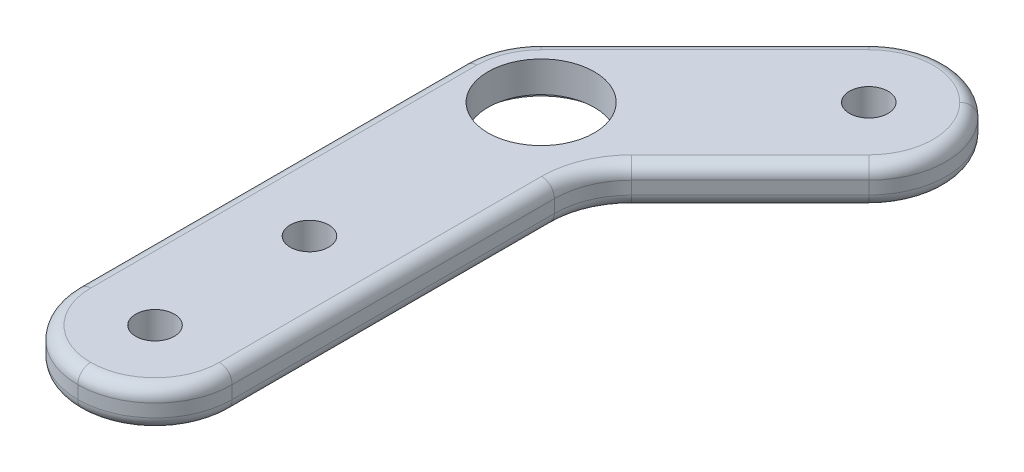
ISO-10303-21;
HEADER;
FILE_DESCRIPTION(('STEP AP214'),'2;1');
FILE_NAME('part.step','',(''),(''),'','','');
FILE_SCHEMA(('AUTOMOTIVE_DESIGN { 1 0 10303 214 1 1 1 1 }'));
ENDSEC;
DATA;
#1=APPLICATION_CONTEXT('core data for automotive mechanical design processes');
#2=APPLICATION_PROTOCOL_DEFINITION('international standard','automotive_design',2000,#1);
#3=PRODUCT_CONTEXT('',#1,'mechanical');
#4=PRODUCT('Part','Part','',(#3));
#5=PRODUCT_RELATED_PRODUCT_CATEGORY('part','',(#4));
#6=PRODUCT_DEFINITION_FORMATION('','',#4);
#7=PRODUCT_DEFINITION_CONTEXT('part definition',#1,'design');
#8=PRODUCT_DEFINITION('design','',#6,#7);
#9=PRODUCT_DEFINITION_SHAPE('','',#8);
#10=(LENGTH_UNIT() NAMED_UNIT(*) SI_UNIT(.MILLI.,.METRE.));
#11=(NAMED_UNIT(*) PLANE_ANGLE_UNIT() SI_UNIT($,.RADIAN.));
#12=(NAMED_UNIT(*) SI_UNIT($,.STERADIAN.) SOLID_ANGLE_UNIT());
#13=UNCERTAINTY_MEASURE_WITH_UNIT(LENGTH_MEASURE(1.E-05),#10,'distance_accuracy_value','');
#14=(GEOMETRIC_REPRESENTATION_CONTEXT(3) GLOBAL_UNCERTAINTY_ASSIGNED_CONTEXT((#13)) GLOBAL_UNIT_ASSIGNED_CONTEXT((#10,
#11,#12)) REPRESENTATION_CONTEXT('',''));
#15=CARTESIAN_POINT('',(0.,0.,0.));
#16=DIRECTION('',(0.,0.,1.));
#17=DIRECTION('',(1.,0.,0.));
#18=AXIS2_PLACEMENT_3D('',#15,#16,#17);
#19=CARTESIAN_POINT('',(0.,6.35,-31.7500000000001));
#20=DIRECTION('',(0.,-1.,0.));
#21=DIRECTION('',(0.,0.,-1.));
#22=AXIS2_PLACEMENT_3D('',#19,#20,#21);
#23=CYLINDRICAL_SURFACE('',#22,8.73125);
#24=CARTESIAN_POINT('',(0.,6.35,-31.7500000000001));
#25=DIRECTION('',(0.,1.,0.));
#26=DIRECTION('',(0.,0.,1.));
#27=AXIS2_PLACEMENT_3D('',#24,#25,#26);
#28=CIRCLE('',#27,8.73125);
#29=CARTESIAN_POINT('',(0.,6.35,-23.0187500000001));
#30=VERTEX_POINT('',#29);
#31=EDGE_CURVE('E788',#30,#30,#28,.T.);
#32=ORIENTED_EDGE('',*,*,#31,.T.);
#33=EDGE_LOOP('',(#32));
#34=FACE_BOUND('',#33,.T.);
#35=CARTESIAN_POINT('',(0.,1.27,-31.7500000000001));
#36=DIRECTION('',(0.,-1.,0.));
#37=DIRECTION('',(0.,0.,-1.));
#38=AXIS2_PLACEMENT_3D('',#35,#36,#37);
#39=CIRCLE('',#38,8.73125);
#40=CARTESIAN_POINT('',(0.,1.27,-40.4812500000001));
#41=VERTEX_POINT('',#40);
#42=EDGE_CURVE('E45',#41,#41,#39,.T.);
#43=ORIENTED_EDGE('',*,*,#42,.T.);
#44=EDGE_LOOP('',(#43));
#45=FACE_BOUND('',#44,.T.);
#46=ADVANCED_FACE('F41',(#34,#45),#23,.F.);
#47=CARTESIAN_POINT('',(-24.8552561210692,6.35,-24.8552561210689));
#48=DIRECTION('',(0.707106781186551,0.,0.707106781186544));
#49=DIRECTION('',(0.707106781186544,0.,-0.707106781186551));
#50=AXIS2_PLACEMENT_3D('',#47,#48,#49);
#51=PLANE('',#50);
#52=DIRECTION('',(0.,-1.,0.));
#53=VECTOR('',#52,1.);
#54=CARTESIAN_POINT('',(17.960512242138,6.35,-67.6710244842766));
#55=LINE('',#54,#53);
#56=CARTESIAN_POINT('',(17.960512242138,4.23333333333333,-67.6710244842766));
#57=VERTEX_POINT('',#56);
#58=CARTESIAN_POINT('',(17.960512242138,2.11666666666667,-67.6710244842766));
#59=VERTEX_POINT('',#58);
#60=EDGE_CURVE('E208',#57,#59,#55,.T.);
#61=ORIENTED_EDGE('',*,*,#60,.T.);
#62=DIRECTION('',(-0.707106781186544,0.,0.707106781186551));
#63=VECTOR('',#62,1.);
#64=CARTESIAN_POINT('',(-24.8552561210692,2.11666666666667,-24.8552561210689));
#65=LINE('',#64,#63);
#66=CARTESIAN_POINT('',(-8.9802561210692,2.11666666666667,-40.7302561210691));
#67=VERTEX_POINT('',#66);
#68=EDGE_CURVE('E257',#59,#67,#65,.T.);
#69=ORIENTED_EDGE('',*,*,#68,.T.);
#70=DIRECTION('',(0.,-1.,0.));
#71=VECTOR('',#70,1.);
#72=CARTESIAN_POINT('',(-8.9802561210692,6.35,-40.7302561210691));
#73=LINE('',#72,#71);
#74=CARTESIAN_POINT('',(-8.9802561210692,4.23333333333333,-40.7302561210691));
#75=VERTEX_POINT('',#74);
#76=EDGE_CURVE('E348',#75,#67,#73,.T.);
#77=ORIENTED_EDGE('',*,*,#76,.F.);
#78=DIRECTION('',(-0.707106781186544,0.,0.707106781186551));
#79=VECTOR('',#78,1.);
#80=CARTESIAN_POINT('',(17.960512242138,4.23333333333333,-67.6710244842767));
#81=LINE('',#80,#79);
#82=EDGE_CURVE('E255',#75,#57,#81,.F.);
#83=ORIENTED_EDGE('',*,*,#82,.T.);
#84=EDGE_LOOP('',(#61,#69,#77,#83));
#85=FACE_BOUND('',#84,.T.);
#86=ADVANCED_FACE('F354',(#85),#51,.F.);
#87=CARTESIAN_POINT('',(0.,6.35,-31.7500000000001));
#88=DIRECTION('',(0.,-1.,0.));
#89=DIRECTION('',(0.,0.,-1.));
#90=AXIS2_PLACEMENT_3D('',#87,#88,#89);
#91=CYLINDRICAL_SURFACE('',#90,12.7);
#92=ORIENTED_EDGE('',*,*,#76,.T.);
#93=CARTESIAN_POINT('',(0.,2.11666666666667,-31.7500000000001));
#94=DIRECTION('',(0.,1.,0.));
#95=DIRECTION('',(0.,0.,1.));
#96=AXIS2_PLACEMENT_3D('',#93,#94,#95);
#97=CIRCLE('',#96,12.7);
#98=CARTESIAN_POINT('',(-12.7,2.11666666666667,-31.7500000000001));
#99=VERTEX_POINT('',#98);
#100=EDGE_CURVE('E253',#67,#99,#97,.T.);
#101=ORIENTED_EDGE('',*,*,#100,.T.);
#102=DIRECTION('',(0.,-1.,0.));
#103=VECTOR('',#102,1.);
#104=CARTESIAN_POINT('',(-12.7,6.35,-31.7500000000001));
#105=LINE('',#104,#103);
#106=CARTESIAN_POINT('',(-12.7,4.23333333333333,-31.7500000000001));
#107=VERTEX_POINT('',#106);
#108=EDGE_CURVE('E351',#107,#99,#105,.T.);
#109=ORIENTED_EDGE('',*,*,#108,.F.);
#110=CARTESIAN_POINT('',(0.,4.23333333333333,-31.7500000000001));
#111=DIRECTION('',(0.,1.,0.));
#112=DIRECTION('',(0.,0.,1.));
#113=AXIS2_PLACEMENT_3D('',#110,#111,#112);
#114=CIRCLE('',#113,12.7);
#115=EDGE_CURVE('E251',#107,#75,#114,.F.);
#116=ORIENTED_EDGE('',*,*,#115,.T.);
#117=EDGE_LOOP('',(#92,#101,#109,#116));
#118=FACE_BOUND('',#117,.T.);
#119=ADVANCED_FACE('F347',(#118),#91,.T.);
#120=CARTESIAN_POINT('',(-12.7,6.35,0.));
#121=DIRECTION('',(-1.,0.,0.));
#122=DIRECTION('',(0.,0.,1.));
#123=AXIS2_PLACEMENT_3D('',#120,#121,#122);
#124=PLANE('',#123);
#125=ORIENTED_EDGE('',*,*,#108,.T.);
#126=DIRECTION('',(0.,0.,-1.));
#127=VECTOR('',#126,1.);
#128=CARTESIAN_POINT('',(-12.7,2.11666666666667,31.7499999999999));
#129=LINE('',#128,#127);
#130=CARTESIAN_POINT('',(-12.7,2.11666666666667,31.7499999999999));
#131=VERTEX_POINT('',#130);
#132=EDGE_CURVE('E249',#99,#131,#129,.F.);
#133=ORIENTED_EDGE('',*,*,#132,.T.);
#134=DIRECTION('',(0.,-1.,0.));
#135=VECTOR('',#134,1.);
#136=CARTESIAN_POINT('',(-12.7,6.35,31.7499999999999));
#137=LINE('',#136,#135);
#138=CARTESIAN_POINT('',(-12.7,4.23333333333333,31.7499999999999));
#139=VERTEX_POINT('',#138);
#140=EDGE_CURVE('E205',#131,#139,#137,.F.);
#141=ORIENTED_EDGE('',*,*,#140,.T.);
#142=DIRECTION('',(0.,0.,-1.));
#143=VECTOR('',#142,1.);
#144=CARTESIAN_POINT('',(-12.7,4.23333333333333,0.));
#145=LINE('',#144,#143);
#146=EDGE_CURVE('E247',#139,#107,#145,.T.);
#147=ORIENTED_EDGE('',*,*,#146,.T.);
#148=EDGE_LOOP('',(#125,#133,#141,#147));
#149=FACE_BOUND('',#148,.T.);
#150=ADVANCED_FACE('F505',(#149),#124,.T.);
#151=CARTESIAN_POINT('',(12.7,6.35,0.));
#152=DIRECTION('',(-1.,0.,0.));
#153=DIRECTION('',(0.,0.,1.));
#154=AXIS2_PLACEMENT_3D('',#151,#152,#153);
#155=PLANE('',#154);
#156=DIRECTION('',(0.,-1.,0.));
#157=VECTOR('',#156,1.);
#158=CARTESIAN_POINT('',(12.7,6.35,31.7499999999999));
#159=LINE('',#158,#157);
#160=CARTESIAN_POINT('',(12.7,4.23333333333333,31.7499999999999));
#161=VERTEX_POINT('',#160);
#162=CARTESIAN_POINT('',(12.7,2.11666666666667,31.7499999999999));
#163=VERTEX_POINT('',#162);
#164=EDGE_CURVE('E368',#161,#163,#159,.T.);
#165=ORIENTED_EDGE('',*,*,#164,.T.);
#166=DIRECTION('',(0.,0.,-1.));
#167=VECTOR('',#166,1.);
#168=CARTESIAN_POINT('',(12.7,2.11666666666667,0.));
#169=LINE('',#168,#167);
#170=CARTESIAN_POINT('',(12.7,2.11666666666667,-21.2289755157235));
#171=VERTEX_POINT('',#170);
#172=EDGE_CURVE('E237',#163,#171,#169,.T.);
#173=ORIENTED_EDGE('',*,*,#172,.T.);
#174=DIRECTION('',(0.,-1.,0.));
#175=VECTOR('',#174,1.);
#176=CARTESIAN_POINT('',(12.7,6.35,-21.2289755157235));
#177=LINE('',#176,#175);
#178=CARTESIAN_POINT('',(12.7,4.23333333333333,-21.2289755157235));
#179=VERTEX_POINT('',#178);
#180=EDGE_CURVE('E371',#171,#179,#177,.F.);
#181=ORIENTED_EDGE('',*,*,#180,.T.);
#182=DIRECTION('',(0.,0.,-1.));
#183=VECTOR('',#182,1.);
#184=CARTESIAN_POINT('',(12.7,4.23333333333333,31.7499999999999));
#185=LINE('',#184,#183);
#186=EDGE_CURVE('E235',#179,#161,#185,.F.);
#187=ORIENTED_EDGE('',*,*,#186,.T.);
#188=EDGE_LOOP('',(#165,#173,#181,#187));
#189=FACE_BOUND('',#188,.T.);
#190=ADVANCED_FACE('F502',(#189),#155,.F.);
#191=CARTESIAN_POINT('',(-6.89474387893084,6.35,-6.89474387893076));
#192=DIRECTION('',(-0.707106781186551,0.,-0.707106781186544));
#193=DIRECTION('',(-0.707106781186544,0.,0.707106781186551));
#194=AXIS2_PLACEMENT_3D('',#191,#192,#193);
#195=PLANE('',#194);
#196=DIRECTION('',(0.,-1.,0.));
#197=VECTOR('',#196,1.);
#198=CARTESIAN_POINT('',(16.4197438789308,0.,-30.2092316367927));
#199=LINE('',#198,#197);
#200=CARTESIAN_POINT('',(16.4197438789308,4.23333333333333,-30.2092316367927));
#201=VERTEX_POINT('',#200);
#202=CARTESIAN_POINT('',(16.4197438789308,2.11666666666667,-30.2092316367927));
#203=VERTEX_POINT('',#202);
#204=EDGE_CURVE('E360',#201,#203,#199,.T.);
#205=ORIENTED_EDGE('',*,*,#204,.T.);
#206=DIRECTION('',(0.707106781186544,0.,-0.707106781186551));
#207=VECTOR('',#206,1.);
#208=CARTESIAN_POINT('',(-6.89474387893084,2.11666666666667,-6.89474387893076));
#209=LINE('',#208,#207);
#210=CARTESIAN_POINT('',(35.9210244842764,2.11666666666667,-49.7105122421385));
#211=VERTEX_POINT('',#210);
#212=EDGE_CURVE('E11',#203,#211,#209,.T.);
#213=ORIENTED_EDGE('',*,*,#212,.T.);
#214=DIRECTION('',(0.,-1.,0.));
#215=VECTOR('',#214,1.);
#216=CARTESIAN_POINT('',(35.9210244842764,6.35,-49.7105122421385));
#217=LINE('',#216,#215);
#218=CARTESIAN_POINT('',(35.9210244842764,4.23333333333333,-49.7105122421385));
#219=VERTEX_POINT('',#218);
#220=EDGE_CURVE('E357',#211,#219,#217,.F.);
#221=ORIENTED_EDGE('',*,*,#220,.T.);
#222=DIRECTION('',(0.707106781186544,0.,-0.707106781186551));
#223=VECTOR('',#222,1.);
#224=CARTESIAN_POINT('',(16.4197438789308,4.23333333333333,-30.2092316367927));
#225=LINE('',#224,#223);
#226=EDGE_CURVE('E50',#219,#201,#225,.F.);
#227=ORIENTED_EDGE('',*,*,#226,.T.);
#228=EDGE_LOOP('',(#205,#213,#221,#227));
#229=FACE_BOUND('',#228,.T.);
#230=ADVANCED_FACE('F422',(#229),#195,.F.);
#231=CARTESIAN_POINT('',(0.,6.35,31.7499999999999));
#232=DIRECTION('',(0.,-1.,0.));
#233=DIRECTION('',(0.,0.,-1.));
#234=AXIS2_PLACEMENT_3D('',#231,#232,#233);
#235=CYLINDRICAL_SURFACE('',#234,3.175);
#236=CARTESIAN_POINT('',(0.,6.35,31.7499999999999));
#237=DIRECTION('',(0.,1.,0.));
#238=DIRECTION('',(0.,0.,1.));
#239=AXIS2_PLACEMENT_3D('',#236,#237,#238);
#240=CIRCLE('',#239,3.175);
#241=CARTESIAN_POINT('',(0.,6.35,34.9249999999999));
#242=VERTEX_POINT('',#241);
#243=EDGE_CURVE('E784',#242,#242,#240,.T.);
#244=ORIENTED_EDGE('',*,*,#243,.T.);
#245=EDGE_LOOP('',(#244));
#246=FACE_BOUND('',#245,.T.);
#247=CARTESIAN_POINT('',(0.,0.,31.7499999999999));
#248=DIRECTION('',(0.,1.,0.));
#249=DIRECTION('',(0.,0.,1.));
#250=AXIS2_PLACEMENT_3D('',#247,#248,#249);
#251=CIRCLE('',#250,3.175);
#252=CARTESIAN_POINT('',(0.,0.,34.9249999999999));
#253=VERTEX_POINT('',#252);
#254=EDGE_CURVE('E381',#253,#253,#251,.T.);
#255=ORIENTED_EDGE('',*,*,#254,.F.);
#256=EDGE_LOOP('',(#255));
#257=FACE_BOUND('',#256,.T.);
#258=ADVANCED_FACE('F492',(#246,#257),#235,.F.);
#259=CARTESIAN_POINT('',(0.,6.35,6.34999999999994));
#260=DIRECTION('',(0.,-1.,0.));
#261=DIRECTION('',(0.,0.,-1.));
#262=AXIS2_PLACEMENT_3D('',#259,#260,#261);
#263=CYLINDRICAL_SURFACE('',#262,3.175);
#264=CARTESIAN_POINT('',(0.,6.35,6.34999999999994));
#265=DIRECTION('',(0.,1.,0.));
#266=DIRECTION('',(0.,0.,1.));
#267=AXIS2_PLACEMENT_3D('',#264,#265,#266);
#268=CIRCLE('',#267,3.175);
#269=CARTESIAN_POINT('',(0.,6.35,9.52499999999994));
#270=VERTEX_POINT('',#269);
#271=EDGE_CURVE('E781',#270,#270,#268,.T.);
#272=ORIENTED_EDGE('',*,*,#271,.T.);
#273=EDGE_LOOP('',(#272));
#274=FACE_BOUND('',#273,.T.);
#275=CARTESIAN_POINT('',(0.,0.,6.34999999999994));
#276=DIRECTION('',(0.,1.,0.));
#277=DIRECTION('',(0.,0.,1.));
#278=AXIS2_PLACEMENT_3D('',#275,#276,#277);
#279=CIRCLE('',#278,3.175);
#280=CARTESIAN_POINT('',(0.,0.,9.52499999999994));
#281=VERTEX_POINT('',#280);
#282=EDGE_CURVE('E376',#281,#281,#279,.T.);
#283=ORIENTED_EDGE('',*,*,#282,.F.);
#284=EDGE_LOOP('',(#283));
#285=FACE_BOUND('',#284,.T.);
#286=ADVANCED_FACE('F495',(#274,#285),#263,.F.);
#287=CARTESIAN_POINT('',(26.9407683632073,6.35,-58.6907683632077));
#288=DIRECTION('',(0.,-1.,0.));
#289=DIRECTION('',(0.,0.,-1.));
#290=AXIS2_PLACEMENT_3D('',#287,#288,#289);
#291=CYLINDRICAL_SURFACE('',#290,3.175);
#292=CARTESIAN_POINT('',(26.9407683632073,6.35,-58.6907683632077));
#293=DIRECTION('',(0.,1.,0.));
#294=DIRECTION('',(0.,0.,1.));
#295=AXIS2_PLACEMENT_3D('',#292,#293,#294);
#296=CIRCLE('',#295,3.175);
#297=CARTESIAN_POINT('',(26.9407683632073,6.35,-55.5157683632077));
#298=VERTEX_POINT('',#297);
#299=EDGE_CURVE('E362',#298,#298,#296,.T.);
#300=ORIENTED_EDGE('',*,*,#299,.T.);
#301=EDGE_LOOP('',(#300));
#302=FACE_BOUND('',#301,.T.);
#303=CARTESIAN_POINT('',(26.9407683632073,0.,-58.6907683632077));
#304=DIRECTION('',(0.,1.,0.));
#305=DIRECTION('',(0.,0.,1.));
#306=AXIS2_PLACEMENT_3D('',#303,#304,#305);
#307=CIRCLE('',#306,3.175);
#308=CARTESIAN_POINT('',(26.9407683632073,0.,-55.5157683632077));
#309=VERTEX_POINT('',#308);
#310=EDGE_CURVE('E785',#309,#309,#307,.T.);
#311=ORIENTED_EDGE('',*,*,#310,.F.);
#312=EDGE_LOOP('',(#311));
#313=FACE_BOUND('',#312,.T.);
#314=ADVANCED_FACE('F490',(#302,#313),#291,.F.);
#315=CARTESIAN_POINT('',(0.,6.35,0.));
#316=DIRECTION('',(0.,1.,0.));
#317=DIRECTION('',(0.,0.,1.));
#318=AXIS2_PLACEMENT_3D('',#315,#316,#317);
#319=PLANE('',#318);
#320=DIRECTION('',(0.,0.,-1.));
#321=VECTOR('',#320,1.);
#322=CARTESIAN_POINT('',(10.5833333333333,6.35,-21.2289755157235));
#323=LINE('',#322,#321);
#324=CARTESIAN_POINT('',(10.5833333333333,6.35,31.7499999999999));
#325=VERTEX_POINT('',#324);
#326=CARTESIAN_POINT('',(10.5833333333333,6.35,-21.2289755157235));
#327=VERTEX_POINT('',#326);
#328=EDGE_CURVE('E58',#325,#327,#323,.T.);
#329=ORIENTED_EDGE('',*,*,#328,.T.);
#330=CARTESIAN_POINT('',(25.4,6.35,-21.2289755157236));
#331=DIRECTION('',(0.,1.,0.));
#332=DIRECTION('',(0.,0.,1.));
#333=AXIS2_PLACEMENT_3D('',#330,#331,#332);
#334=CIRCLE('',#333,14.8166666666667);
#335=CARTESIAN_POINT('',(14.9230345254193,6.35,-31.7059409903042));
#336=VERTEX_POINT('',#335);
#337=EDGE_CURVE('E282',#327,#336,#334,.F.);
#338=ORIENTED_EDGE('',*,*,#337,.T.);
#339=DIRECTION('',(0.707106781186544,0.,-0.707106781186551));
#340=VECTOR('',#339,1.);
#341=CARTESIAN_POINT('',(34.4243151307649,6.35,-51.20722159565));
#342=LINE('',#341,#340);
#343=CARTESIAN_POINT('',(34.4243151307649,6.35,-51.20722159565));
#344=VERTEX_POINT('',#343);
#345=EDGE_CURVE('E266',#336,#344,#342,.T.);
#346=ORIENTED_EDGE('',*,*,#345,.T.);
#347=CARTESIAN_POINT('',(26.9407683632072,6.35,-58.6907683632076));
#348=DIRECTION('',(0.,1.,0.));
#349=DIRECTION('',(0.,0.,1.));
#350=AXIS2_PLACEMENT_3D('',#347,#348,#349);
#351=CIRCLE('',#350,10.5833333333333);
#352=CARTESIAN_POINT('',(34.4243151307648,6.35,-66.1743151307652));
#353=VERTEX_POINT('',#352);
#354=EDGE_CURVE('E268',#344,#353,#351,.T.);
#355=ORIENTED_EDGE('',*,*,#354,.T.);
#356=CARTESIAN_POINT('',(26.9407683632072,6.35,-58.6907683632075));
#357=DIRECTION('',(0.,1.,0.));
#358=DIRECTION('',(0.,0.,1.));
#359=AXIS2_PLACEMENT_3D('',#356,#357,#358);
#360=CIRCLE('',#359,10.5833333333333);
#361=CARTESIAN_POINT('',(19.4572215956495,6.35,-66.1743151307651));
#362=VERTEX_POINT('',#361);
#363=EDGE_CURVE('E270',#353,#362,#360,.T.);
#364=ORIENTED_EDGE('',*,*,#363,.T.);
#365=DIRECTION('',(-0.707106781186544,0.,0.707106781186551));
#366=VECTOR('',#365,1.);
#367=CARTESIAN_POINT('',(-7.48354676755766,6.35,-39.2335467675576));
#368=LINE('',#367,#366);
#369=CARTESIAN_POINT('',(-7.48354676755767,6.35,-39.2335467675576));
#370=VERTEX_POINT('',#369);
#371=EDGE_CURVE('E272',#362,#370,#368,.T.);
#372=ORIENTED_EDGE('',*,*,#371,.T.);
#373=CARTESIAN_POINT('',(0.,6.35,-31.7500000000001));
#374=DIRECTION('',(0.,1.,0.));
#375=DIRECTION('',(0.,0.,1.));
#376=AXIS2_PLACEMENT_3D('',#373,#374,#375);
#377=CIRCLE('',#376,10.5833333333333);
#378=CARTESIAN_POINT('',(-10.5833333333333,6.35,-31.7500000000001));
#379=VERTEX_POINT('',#378);
#380=EDGE_CURVE('E274',#370,#379,#377,.T.);
#381=ORIENTED_EDGE('',*,*,#380,.T.);
#382=DIRECTION('',(0.,0.,-1.));
#383=VECTOR('',#382,1.);
#384=CARTESIAN_POINT('',(-10.5833333333333,6.35,0.));
#385=LINE('',#384,#383);
#386=CARTESIAN_POINT('',(-10.5833333333333,6.35,31.7499999999999));
#387=VERTEX_POINT('',#386);
#388=EDGE_CURVE('E276',#379,#387,#385,.F.);
#389=ORIENTED_EDGE('',*,*,#388,.T.);
#390=CARTESIAN_POINT('',(0.,6.35,31.7499999999999));
#391=DIRECTION('',(0.,1.,0.));
#392=DIRECTION('',(0.,0.,1.));
#393=AXIS2_PLACEMENT_3D('',#390,#391,#392);
#394=CIRCLE('',#393,10.5833333333333);
#395=CARTESIAN_POINT('',(0.,6.35,42.3333333333333));
#396=VERTEX_POINT('',#395);
#397=EDGE_CURVE('E278',#387,#396,#394,.T.);
#398=ORIENTED_EDGE('',*,*,#397,.T.);
#399=CARTESIAN_POINT('',(0.,6.35,31.7499999999999));
#400=DIRECTION('',(0.,1.,0.));
#401=DIRECTION('',(0.,0.,1.));
#402=AXIS2_PLACEMENT_3D('',#399,#400,#401);
#403=CIRCLE('',#402,10.5833333333333);
#404=EDGE_CURVE('E63',#396,#325,#403,.T.);
#405=ORIENTED_EDGE('',*,*,#404,.T.);
#406=EDGE_LOOP('',(#329,#338,#346,#355,#364,#372,#381,#389,#398,#405));
#407=FACE_BOUND('',#406,.T.);
#408=ORIENTED_EDGE('',*,*,#271,.F.);
#409=EDGE_LOOP('',(#408));
#410=FACE_BOUND('',#409,.T.);
#411=ORIENTED_EDGE('',*,*,#243,.F.);
#412=EDGE_LOOP('',(#411));
#413=FACE_BOUND('',#412,.T.);
#414=ORIENTED_EDGE('',*,*,#31,.F.);
#415=EDGE_LOOP('',(#414));
#416=FACE_BOUND('',#415,.T.);
#417=ORIENTED_EDGE('',*,*,#299,.F.);
#418=EDGE_LOOP('',(#417));
#419=FACE_BOUND('',#418,.T.);
#420=ADVANCED_FACE('F408',(#407,#410,#413,#416,#419),#319,.T.);
#421=CARTESIAN_POINT('',(0.,0.,0.));
#422=DIRECTION('',(0.,1.,0.));
#423=DIRECTION('',(0.,0.,1.));
#424=AXIS2_PLACEMENT_3D('',#421,#422,#423);
#425=PLANE('',#424);
#426=CARTESIAN_POINT('',(0.,0.,-31.7500000000001));
#427=DIRECTION('',(0.,-1.,0.));
#428=DIRECTION('',(0.,0.,-1.));
#429=AXIS2_PLACEMENT_3D('',#426,#427,#428);
#430=CIRCLE('',#429,10.2489);
#431=CARTESIAN_POINT('',(0.,0.,-41.9989000000001));
#432=VERTEX_POINT('',#431);
#433=EDGE_CURVE('E776',#432,#432,#430,.T.);
#434=ORIENTED_EDGE('',*,*,#433,.F.);
#435=EDGE_LOOP('',(#434));
#436=FACE_BOUND('',#435,.T.);
#437=DIRECTION('',(0.707106781186544,0.,-0.707106781186551));
#438=VECTOR('',#437,1.);
#439=CARTESIAN_POINT('',(-8.39145323244237,0.,-8.39145323244228));
#440=LINE('',#439,#438);
#441=CARTESIAN_POINT('',(34.4243151307649,0.,-51.20722159565));
#442=VERTEX_POINT('',#441);
#443=CARTESIAN_POINT('',(14.9230345254193,0.,-31.7059409903042));
#444=VERTEX_POINT('',#443);
#445=EDGE_CURVE('E184',#442,#444,#440,.F.);
#446=ORIENTED_EDGE('',*,*,#445,.T.);
#447=CARTESIAN_POINT('',(25.4,0.,-21.2289755157236));
#448=DIRECTION('',(0.,1.,0.));
#449=DIRECTION('',(0.,0.,1.));
#450=AXIS2_PLACEMENT_3D('',#447,#448,#449);
#451=CIRCLE('',#450,14.8166666666667);
#452=CARTESIAN_POINT('',(10.5833333333333,0.,-21.2289755157235));
#453=VERTEX_POINT('',#452);
#454=EDGE_CURVE('E227',#444,#453,#451,.T.);
#455=ORIENTED_EDGE('',*,*,#454,.T.);
#456=DIRECTION('',(0.,0.,-1.));
#457=VECTOR('',#456,1.);
#458=CARTESIAN_POINT('',(10.5833333333333,0.,0.));
#459=LINE('',#458,#457);
#460=CARTESIAN_POINT('',(10.5833333333333,0.,31.7499999999999));
#461=VERTEX_POINT('',#460);
#462=EDGE_CURVE('E225',#453,#461,#459,.F.);
#463=ORIENTED_EDGE('',*,*,#462,.T.);
#464=CARTESIAN_POINT('',(0.,0.,31.7499999999999));
#465=DIRECTION('',(0.,1.,0.));
#466=DIRECTION('',(0.,0.,1.));
#467=AXIS2_PLACEMENT_3D('',#464,#465,#466);
#468=CIRCLE('',#467,10.5833333333333);
#469=CARTESIAN_POINT('',(0.,0.,42.3333333333333));
#470=VERTEX_POINT('',#469);
#471=EDGE_CURVE('E223',#461,#470,#468,.F.);
#472=ORIENTED_EDGE('',*,*,#471,.T.);
#473=CARTESIAN_POINT('',(0.,0.,31.7499999999999));
#474=DIRECTION('',(0.,1.,0.));
#475=DIRECTION('',(0.,0.,1.));
#476=AXIS2_PLACEMENT_3D('',#473,#474,#475);
#477=CIRCLE('',#476,10.5833333333333);
#478=CARTESIAN_POINT('',(-10.5833333333333,0.,31.7499999999999));
#479=VERTEX_POINT('',#478);
#480=EDGE_CURVE('E221',#470,#479,#477,.F.);
#481=ORIENTED_EDGE('',*,*,#480,.T.);
#482=DIRECTION('',(0.,0.,-1.));
#483=VECTOR('',#482,1.);
#484=CARTESIAN_POINT('',(-10.5833333333333,0.,-31.7500000000001));
#485=LINE('',#484,#483);
#486=CARTESIAN_POINT('',(-10.5833333333333,0.,-31.7500000000001));
#487=VERTEX_POINT('',#486);
#488=EDGE_CURVE('E219',#479,#487,#485,.T.);
#489=ORIENTED_EDGE('',*,*,#488,.T.);
#490=CARTESIAN_POINT('',(0.,0.,-31.7500000000001));
#491=DIRECTION('',(0.,1.,0.));
#492=DIRECTION('',(0.,0.,1.));
#493=AXIS2_PLACEMENT_3D('',#490,#491,#492);
#494=CIRCLE('',#493,10.5833333333333);
#495=CARTESIAN_POINT('',(-7.48354676755767,0.,-39.2335467675576));
#496=VERTEX_POINT('',#495);
#497=EDGE_CURVE('E217',#487,#496,#494,.F.);
#498=ORIENTED_EDGE('',*,*,#497,.T.);
#499=DIRECTION('',(-0.707106781186544,0.,0.707106781186551));
#500=VECTOR('',#499,1.);
#501=CARTESIAN_POINT('',(-23.3585467675577,0.,-23.3585467675574));
#502=LINE('',#501,#500);
#503=CARTESIAN_POINT('',(19.4572215956495,0.,-66.1743151307651));
#504=VERTEX_POINT('',#503);
#505=EDGE_CURVE('E215',#496,#504,#502,.F.);
#506=ORIENTED_EDGE('',*,*,#505,.T.);
#507=CARTESIAN_POINT('',(26.9407683632072,0.,-58.6907683632075));
#508=DIRECTION('',(0.,1.,0.));
#509=DIRECTION('',(0.,0.,1.));
#510=AXIS2_PLACEMENT_3D('',#507,#508,#509);
#511=CIRCLE('',#510,10.5833333333333);
#512=CARTESIAN_POINT('',(34.4243151307648,0.,-66.1743151307652));
#513=VERTEX_POINT('',#512);
#514=EDGE_CURVE('E187',#504,#513,#511,.F.);
#515=ORIENTED_EDGE('',*,*,#514,.T.);
#516=CARTESIAN_POINT('',(26.9407683632072,0.,-58.6907683632076));
#517=DIRECTION('',(0.,1.,0.));
#518=DIRECTION('',(0.,0.,1.));
#519=AXIS2_PLACEMENT_3D('',#516,#517,#518);
#520=CIRCLE('',#519,10.5833333333333);
#521=EDGE_CURVE('E178',#513,#442,#520,.F.);
#522=ORIENTED_EDGE('',*,*,#521,.T.);
#523=EDGE_LOOP('',(#446,#455,#463,#472,#481,#489,#498,#506,#515,#522));
#524=FACE_BOUND('',#523,.T.);
#525=ORIENTED_EDGE('',*,*,#282,.T.);
#526=EDGE_LOOP('',(#525));
#527=FACE_BOUND('',#526,.T.);
#528=ORIENTED_EDGE('',*,*,#254,.T.);
#529=EDGE_LOOP('',(#528));
#530=FACE_BOUND('',#529,.T.);
#531=ORIENTED_EDGE('',*,*,#310,.T.);
#532=EDGE_LOOP('',(#531));
#533=FACE_BOUND('',#532,.T.);
#534=ADVANCED_FACE('F180',(#436,#524,#527,#530,#533),#425,.F.);
#535=CARTESIAN_POINT('',(25.4,6.35,-21.2289755157236));
#536=DIRECTION('',(0.,1.,0.));
#537=DIRECTION('',(0.,0.,1.));
#538=AXIS2_PLACEMENT_3D('',#535,#536,#537);
#539=CYLINDRICAL_SURFACE('',#538,12.7);
#540=ORIENTED_EDGE('',*,*,#180,.F.);
#541=CARTESIAN_POINT('',(25.4,2.11666666666667,-21.2289755157236));
#542=DIRECTION('',(0.,1.,0.));
#543=DIRECTION('',(0.,0.,1.));
#544=AXIS2_PLACEMENT_3D('',#541,#542,#543);
#545=CIRCLE('',#544,12.7);
#546=EDGE_CURVE('E232',#171,#203,#545,.F.);
#547=ORIENTED_EDGE('',*,*,#546,.T.);
#548=ORIENTED_EDGE('',*,*,#204,.F.);
#549=CARTESIAN_POINT('',(25.4,4.23333333333333,-21.2289755157236));
#550=DIRECTION('',(0.,1.,0.));
#551=DIRECTION('',(0.,0.,1.));
#552=AXIS2_PLACEMENT_3D('',#549,#550,#551);
#553=CIRCLE('',#552,12.7);
#554=EDGE_CURVE('E229',#201,#179,#553,.T.);
#555=ORIENTED_EDGE('',*,*,#554,.T.);
#556=EDGE_LOOP('',(#540,#547,#548,#555));
#557=FACE_BOUND('',#556,.T.);
#558=ADVANCED_FACE('F426',(#557),#539,.F.);
#559=CARTESIAN_POINT('',(26.9407683632072,6.35,-58.6907683632076));
#560=DIRECTION('',(0.,-1.,0.));
#561=DIRECTION('',(0.,0.,-1.));
#562=AXIS2_PLACEMENT_3D('',#559,#560,#561);
#563=CYLINDRICAL_SURFACE('',#562,12.7);
#564=ORIENTED_EDGE('',*,*,#220,.F.);
#565=CARTESIAN_POINT('',(26.9407683632072,2.11666666666667,-58.6907683632076));
#566=DIRECTION('',(0.,1.,0.));
#567=DIRECTION('',(0.,0.,1.));
#568=AXIS2_PLACEMENT_3D('',#565,#566,#567);
#569=CIRCLE('',#568,12.7);
#570=CARTESIAN_POINT('',(35.9210244842763,2.11666666666667,-67.6710244842768));
#571=VERTEX_POINT('',#570);
#572=EDGE_CURVE('E196',#211,#571,#569,.T.);
#573=ORIENTED_EDGE('',*,*,#572,.T.);
#574=DIRECTION('',(0.,-1.,0.));
#575=VECTOR('',#574,1.);
#576=CARTESIAN_POINT('',(35.9210244842763,6.35,-67.6710244842768));
#577=LINE('',#576,#575);
#578=CARTESIAN_POINT('',(35.9210244842763,4.23333333333333,-67.6710244842768));
#579=VERTEX_POINT('',#578);
#580=EDGE_CURVE('E374',#579,#571,#577,.T.);
#581=ORIENTED_EDGE('',*,*,#580,.F.);
#582=CARTESIAN_POINT('',(26.9407683632072,4.23333333333333,-58.6907683632076));
#583=DIRECTION('',(0.,1.,0.));
#584=DIRECTION('',(0.,0.,1.));
#585=AXIS2_PLACEMENT_3D('',#582,#583,#584);
#586=CIRCLE('',#585,12.7);
#587=EDGE_CURVE('E263',#579,#219,#586,.F.);
#588=ORIENTED_EDGE('',*,*,#587,.T.);
#589=EDGE_LOOP('',(#564,#573,#581,#588));
#590=FACE_BOUND('',#589,.T.);
#591=ADVANCED_FACE('F468',(#590),#563,.T.);
#592=CARTESIAN_POINT('',(26.9407683632072,6.35,-58.6907683632075));
#593=DIRECTION('',(0.,-1.,0.));
#594=DIRECTION('',(0.,0.,-1.));
#595=AXIS2_PLACEMENT_3D('',#592,#593,#594);
#596=CYLINDRICAL_SURFACE('',#595,12.7);
#597=ORIENTED_EDGE('',*,*,#580,.T.);
#598=CARTESIAN_POINT('',(26.9407683632072,2.11666666666667,-58.6907683632075));
#599=DIRECTION('',(0.,1.,0.));
#600=DIRECTION('',(0.,0.,1.));
#601=AXIS2_PLACEMENT_3D('',#598,#599,#600);
#602=CIRCLE('',#601,12.7);
#603=EDGE_CURVE('E261',#571,#59,#602,.T.);
#604=ORIENTED_EDGE('',*,*,#603,.T.);
#605=ORIENTED_EDGE('',*,*,#60,.F.);
#606=CARTESIAN_POINT('',(26.9407683632072,4.23333333333333,-58.6907683632075));
#607=DIRECTION('',(0.,1.,0.));
#608=DIRECTION('',(0.,0.,1.));
#609=AXIS2_PLACEMENT_3D('',#606,#607,#608);
#610=CIRCLE('',#609,12.7);
#611=EDGE_CURVE('E259',#57,#579,#610,.F.);
#612=ORIENTED_EDGE('',*,*,#611,.T.);
#613=EDGE_LOOP('',(#597,#604,#605,#612));
#614=FACE_BOUND('',#613,.T.);
#615=ADVANCED_FACE('F459',(#614),#596,.T.);
#616=CARTESIAN_POINT('',(0.,6.35,31.7499999999999));
#617=DIRECTION('',(0.,-1.,0.));
#618=DIRECTION('',(0.,0.,-1.));
#619=AXIS2_PLACEMENT_3D('',#616,#617,#618);
#620=CYLINDRICAL_SURFACE('',#619,12.7);
#621=DIRECTION('',(0.,-1.,0.));
#622=VECTOR('',#621,1.);
#623=CARTESIAN_POINT('',(0.,6.35,44.4499999999999));
#624=LINE('',#623,#622);
#625=CARTESIAN_POINT('',(0.,2.11666666666667,44.4499999999999));
#626=VERTEX_POINT('',#625);
#627=CARTESIAN_POINT('',(0.,4.23333333333333,44.4499999999999));
#628=VERTEX_POINT('',#627);
#629=EDGE_CURVE('E211',#626,#628,#624,.F.);
#630=ORIENTED_EDGE('',*,*,#629,.F.);
#631=CARTESIAN_POINT('',(0.,2.11666666666667,31.7499999999999));
#632=DIRECTION('',(0.,1.,0.));
#633=DIRECTION('',(0.,0.,1.));
#634=AXIS2_PLACEMENT_3D('',#631,#632,#633);
#635=CIRCLE('',#634,12.7);
#636=EDGE_CURVE('E241',#626,#163,#635,.T.);
#637=ORIENTED_EDGE('',*,*,#636,.T.);
#638=ORIENTED_EDGE('',*,*,#164,.F.);
#639=CARTESIAN_POINT('',(0.,4.23333333333333,31.7499999999999));
#640=DIRECTION('',(0.,1.,0.));
#641=DIRECTION('',(0.,0.,1.));
#642=AXIS2_PLACEMENT_3D('',#639,#640,#641);
#643=CIRCLE('',#642,12.7);
#644=EDGE_CURVE('E239',#161,#628,#643,.F.);
#645=ORIENTED_EDGE('',*,*,#644,.T.);
#646=EDGE_LOOP('',(#630,#637,#638,#645));
#647=FACE_BOUND('',#646,.T.);
#648=ADVANCED_FACE('F475',(#647),#620,.T.);
#649=CARTESIAN_POINT('',(0.,6.35,31.7499999999999));
#650=DIRECTION('',(0.,1.,0.));
#651=DIRECTION('',(0.,0.,1.));
#652=AXIS2_PLACEMENT_3D('',#649,#650,#651);
#653=CYLINDRICAL_SURFACE('',#652,12.7);
#654=ORIENTED_EDGE('',*,*,#140,.F.);
#655=CARTESIAN_POINT('',(0.,2.11666666666667,31.7499999999999));
#656=DIRECTION('',(0.,1.,0.));
#657=DIRECTION('',(0.,0.,1.));
#658=AXIS2_PLACEMENT_3D('',#655,#656,#657);
#659=CIRCLE('',#658,12.7);
#660=EDGE_CURVE('E245',#131,#626,#659,.T.);
#661=ORIENTED_EDGE('',*,*,#660,.T.);
#662=ORIENTED_EDGE('',*,*,#629,.T.);
#663=CARTESIAN_POINT('',(0.,4.23333333333333,31.7499999999999));
#664=DIRECTION('',(0.,1.,0.));
#665=DIRECTION('',(0.,0.,1.));
#666=AXIS2_PLACEMENT_3D('',#663,#664,#665);
#667=CIRCLE('',#666,12.7);
#668=EDGE_CURVE('E243',#628,#139,#667,.F.);
#669=ORIENTED_EDGE('',*,*,#668,.T.);
#670=EDGE_LOOP('',(#654,#661,#662,#669));
#671=FACE_BOUND('',#670,.T.);
#672=ADVANCED_FACE('F388',(#671),#653,.T.);
#673=CARTESIAN_POINT('',(0.,2.11666666666667,-31.7500000000001));
#674=DIRECTION('',(0.,1.,0.));
#675=DIRECTION('',(0.,0.,1.));
#676=AXIS2_PLACEMENT_3D('',#673,#674,#675);
#677=TOROIDAL_SURFACE('',#676,10.5833333333333,2.11666666666667);
#678=CARTESIAN_POINT('',(-10.5833333333333,2.11666666666667,-31.7500000000001));
#679=DIRECTION('',(0.,0.,1.));
#680=DIRECTION('',(1.,0.,0.));
#681=AXIS2_PLACEMENT_3D('',#678,#679,#680);
#682=CIRCLE('',#681,2.11666666666667);
#683=EDGE_CURVE('E301',#99,#487,#682,.T.);
#684=ORIENTED_EDGE('',*,*,#683,.F.);
#685=ORIENTED_EDGE('',*,*,#100,.F.);
#686=CARTESIAN_POINT('',(-7.48354676755767,2.11666666666667,-39.2335467675576));
#687=DIRECTION('',(0.707106781186544,0.,-0.707106781186551));
#688=DIRECTION('',(-0.707106781186551,0.,-0.707106781186544));
#689=AXIS2_PLACEMENT_3D('',#686,#687,#688);
#690=CIRCLE('',#689,2.11666666666667);
#691=EDGE_CURVE('E304',#496,#67,#690,.T.);
#692=ORIENTED_EDGE('',*,*,#691,.F.);
#693=ORIENTED_EDGE('',*,*,#497,.F.);
#694=EDGE_LOOP('',(#684,#685,#692,#693));
#695=FACE_BOUND('',#694,.T.);
#696=ADVANCED_FACE('F451',(#695),#677,.T.);
#697=CARTESIAN_POINT('',(-23.3585467675577,2.11666666666667,-23.3585467675574));
#698=DIRECTION('',(-0.707106781186544,0.,0.707106781186551));
#699=DIRECTION('',(0.707106781186551,0.,0.707106781186544));
#700=AXIS2_PLACEMENT_3D('',#697,#698,#699);
#701=CYLINDRICAL_SURFACE('',#700,2.11666666666667);
#702=ORIENTED_EDGE('',*,*,#691,.T.);
#703=ORIENTED_EDGE('',*,*,#68,.F.);
#704=CARTESIAN_POINT('',(19.4572215956495,2.11666666666667,-66.1743151307651));
#705=DIRECTION('',(0.707106781186541,0.,-0.707106781186554));
#706=DIRECTION('',(-0.707106781186554,0.,-0.707106781186541));
#707=AXIS2_PLACEMENT_3D('',#704,#705,#706);
#708=CIRCLE('',#707,2.11666666666667);
#709=EDGE_CURVE('E298',#504,#59,#708,.T.);
#710=ORIENTED_EDGE('',*,*,#709,.F.);
#711=ORIENTED_EDGE('',*,*,#505,.F.);
#712=EDGE_LOOP('',(#702,#703,#710,#711));
#713=FACE_BOUND('',#712,.T.);
#714=ADVANCED_FACE('F456',(#713),#701,.T.);
#715=CARTESIAN_POINT('',(-10.5833333333333,2.11666666666667,0.));
#716=DIRECTION('',(0.,0.,1.));
#717=DIRECTION('',(1.,0.,0.));
#718=AXIS2_PLACEMENT_3D('',#715,#716,#717);
#719=CYLINDRICAL_SURFACE('',#718,2.11666666666667);
#720=ORIENTED_EDGE('',*,*,#683,.T.);
#721=ORIENTED_EDGE('',*,*,#488,.F.);
#722=CARTESIAN_POINT('',(-10.5833333333333,2.11666666666667,31.7499999999999));
#723=DIRECTION('',(0.,0.,1.));
#724=DIRECTION('',(1.,0.,0.));
#725=AXIS2_PLACEMENT_3D('',#722,#723,#724);
#726=CIRCLE('',#725,2.11666666666667);
#727=EDGE_CURVE('E295',#131,#479,#726,.T.);
#728=ORIENTED_EDGE('',*,*,#727,.F.);
#729=ORIENTED_EDGE('',*,*,#132,.F.);
#730=EDGE_LOOP('',(#720,#721,#728,#729));
#731=FACE_BOUND('',#730,.T.);
#732=ADVANCED_FACE('F447',(#731),#719,.T.);
#733=CARTESIAN_POINT('',(26.9407683632072,2.11666666666667,-58.6907683632075));
#734=DIRECTION('',(0.,1.,0.));
#735=DIRECTION('',(0.,0.,1.));
#736=AXIS2_PLACEMENT_3D('',#733,#734,#735);
#737=TOROIDAL_SURFACE('',#736,10.5833333333333,2.11666666666667);
#738=ORIENTED_EDGE('',*,*,#709,.T.);
#739=ORIENTED_EDGE('',*,*,#603,.F.);
#740=CARTESIAN_POINT('',(34.4243151307648,2.11666666666667,-66.1743151307652));
#741=DIRECTION('',(0.707106781186554,0.,0.707106781186541));
#742=DIRECTION('',(0.707106781186541,0.,-0.707106781186554));
#743=AXIS2_PLACEMENT_3D('',#740,#741,#742);
#744=CIRCLE('',#743,2.11666666666667);
#745=EDGE_CURVE('E293',#513,#571,#744,.T.);
#746=ORIENTED_EDGE('',*,*,#745,.F.);
#747=ORIENTED_EDGE('',*,*,#514,.F.);
#748=EDGE_LOOP('',(#738,#739,#746,#747));
#749=FACE_BOUND('',#748,.T.);
#750=ADVANCED_FACE('F458',(#749),#737,.T.);
#751=CARTESIAN_POINT('',(0.,2.11666666666667,31.7499999999999));
#752=DIRECTION('',(0.,1.,0.));
#753=DIRECTION('',(0.,0.,1.));
#754=AXIS2_PLACEMENT_3D('',#751,#752,#753);
#755=TOROIDAL_SURFACE('',#754,10.5833333333333,2.11666666666667);
#756=ORIENTED_EDGE('',*,*,#727,.T.);
#757=ORIENTED_EDGE('',*,*,#480,.F.);
#758=CARTESIAN_POINT('',(0.,2.11666666666667,42.3333333333333));
#759=DIRECTION('',(1.,0.,0.));
#760=DIRECTION('',(0.,1.,0.));
#761=AXIS2_PLACEMENT_3D('',#758,#759,#760);
#762=CIRCLE('',#761,2.11666666666667);
#763=EDGE_CURVE('E199',#626,#470,#762,.T.);
#764=ORIENTED_EDGE('',*,*,#763,.F.);
#765=ORIENTED_EDGE('',*,*,#660,.F.);
#766=EDGE_LOOP('',(#756,#757,#764,#765));
#767=FACE_BOUND('',#766,.T.);
#768=ADVANCED_FACE('F442',(#767),#755,.T.);
#769=CARTESIAN_POINT('',(26.9407683632072,2.11666666666667,-58.6907683632076));
#770=DIRECTION('',(0.,1.,0.));
#771=DIRECTION('',(0.,0.,1.));
#772=AXIS2_PLACEMENT_3D('',#769,#770,#771);
#773=TOROIDAL_SURFACE('',#772,10.5833333333333,2.11666666666667);
#774=ORIENTED_EDGE('',*,*,#745,.T.);
#775=ORIENTED_EDGE('',*,*,#572,.F.);
#776=CARTESIAN_POINT('',(34.4243151307649,2.11666666666667,-51.20722159565));
#777=DIRECTION('',(-0.707106781186544,0.,0.707106781186551));
#778=DIRECTION('',(0.707106781186551,0.,0.707106781186544));
#779=AXIS2_PLACEMENT_3D('',#776,#777,#778);
#780=CIRCLE('',#779,2.11666666666667);
#781=EDGE_CURVE('E194',#442,#211,#780,.T.);
#782=ORIENTED_EDGE('',*,*,#781,.F.);
#783=ORIENTED_EDGE('',*,*,#521,.F.);
#784=EDGE_LOOP('',(#774,#775,#782,#783));
#785=FACE_BOUND('',#784,.T.);
#786=ADVANCED_FACE('F195',(#785),#773,.T.);
#787=CARTESIAN_POINT('',(0.,2.11666666666667,31.7499999999999));
#788=DIRECTION('',(0.,1.,0.));
#789=DIRECTION('',(0.,0.,1.));
#790=AXIS2_PLACEMENT_3D('',#787,#788,#789);
#791=TOROIDAL_SURFACE('',#790,10.5833333333333,2.11666666666667);
#792=ORIENTED_EDGE('',*,*,#763,.T.);
#793=ORIENTED_EDGE('',*,*,#471,.F.);
#794=CARTESIAN_POINT('',(10.5833333333333,2.11666666666667,31.7499999999999));
#795=DIRECTION('',(0.,0.,-1.));
#796=DIRECTION('',(-1.,0.,0.));
#797=AXIS2_PLACEMENT_3D('',#794,#795,#796);
#798=CIRCLE('',#797,2.11666666666667);
#799=EDGE_CURVE('E200',#163,#461,#798,.T.);
#800=ORIENTED_EDGE('',*,*,#799,.F.);
#801=ORIENTED_EDGE('',*,*,#636,.F.);
#802=EDGE_LOOP('',(#792,#793,#800,#801));
#803=FACE_BOUND('',#802,.T.);
#804=ADVANCED_FACE('F439',(#803),#791,.T.);
#805=CARTESIAN_POINT('',(-8.39145323244237,2.11666666666667,-8.39145323244228));
#806=DIRECTION('',(0.707106781186544,0.,-0.707106781186551));
#807=DIRECTION('',(-0.707106781186551,0.,-0.707106781186544));
#808=AXIS2_PLACEMENT_3D('',#805,#806,#807);
#809=CYLINDRICAL_SURFACE('',#808,2.11666666666667);
#810=ORIENTED_EDGE('',*,*,#781,.T.);
#811=ORIENTED_EDGE('',*,*,#212,.F.);
#812=CARTESIAN_POINT('',(14.9230345254193,2.11666666666667,-31.7059409903042));
#813=DIRECTION('',(-0.707106781186544,0.,0.707106781186551));
#814=DIRECTION('',(0.707106781186551,0.,0.707106781186544));
#815=AXIS2_PLACEMENT_3D('',#812,#813,#814);
#816=CIRCLE('',#815,2.11666666666667);
#817=EDGE_CURVE('E203',#444,#203,#816,.T.);
#818=ORIENTED_EDGE('',*,*,#817,.F.);
#819=ORIENTED_EDGE('',*,*,#445,.F.);
#820=EDGE_LOOP('',(#810,#811,#818,#819));
#821=FACE_BOUND('',#820,.T.);
#822=ADVANCED_FACE('F202',(#821),#809,.T.);
#823=CARTESIAN_POINT('',(10.5833333333333,2.11666666666667,0.));
#824=DIRECTION('',(0.,0.,-1.));
#825=DIRECTION('',(-1.,0.,0.));
#826=AXIS2_PLACEMENT_3D('',#823,#824,#825);
#827=CYLINDRICAL_SURFACE('',#826,2.11666666666667);
#828=ORIENTED_EDGE('',*,*,#799,.T.);
#829=ORIENTED_EDGE('',*,*,#462,.F.);
#830=CARTESIAN_POINT('',(10.5833333333333,2.11666666666667,-21.2289755157235));
#831=DIRECTION('',(0.,0.,-1.));
#832=DIRECTION('',(-1.,0.,0.));
#833=AXIS2_PLACEMENT_3D('',#830,#831,#832);
#834=CIRCLE('',#833,2.11666666666667);
#835=EDGE_CURVE('E285',#171,#453,#834,.T.);
#836=ORIENTED_EDGE('',*,*,#835,.F.);
#837=ORIENTED_EDGE('',*,*,#172,.F.);
#838=EDGE_LOOP('',(#828,#829,#836,#837));
#839=FACE_BOUND('',#838,.T.);
#840=ADVANCED_FACE('F434',(#839),#827,.T.);
#841=CARTESIAN_POINT('',(25.4,2.11666666666667,-21.2289755157236));
#842=DIRECTION('',(0.,1.,0.));
#843=DIRECTION('',(0.,0.,1.));
#844=AXIS2_PLACEMENT_3D('',#841,#842,#843);
#845=TOROIDAL_SURFACE('',#844,14.8166666666667,2.11666666666667);
#846=ORIENTED_EDGE('',*,*,#817,.T.);
#847=ORIENTED_EDGE('',*,*,#546,.F.);
#848=ORIENTED_EDGE('',*,*,#835,.T.);
#849=ORIENTED_EDGE('',*,*,#454,.F.);
#850=EDGE_LOOP('',(#846,#847,#848,#849));
#851=FACE_BOUND('',#850,.T.);
#852=ADVANCED_FACE('F430',(#851),#845,.T.);
#853=CARTESIAN_POINT('',(0.,4.23333333333333,-31.7500000000001));
#854=DIRECTION('',(0.,1.,0.));
#855=DIRECTION('',(0.,0.,1.));
#856=AXIS2_PLACEMENT_3D('',#853,#854,#855);
#857=TOROIDAL_SURFACE('',#856,10.5833333333333,2.11666666666667);
#858=CARTESIAN_POINT('',(-7.48354676755767,4.23333333333333,-39.2335467675576));
#859=DIRECTION('',(0.707106781186543,0.,-0.707106781186552));
#860=DIRECTION('',(-0.707106781186552,0.,-0.707106781186543));
#861=AXIS2_PLACEMENT_3D('',#858,#859,#860);
#862=CIRCLE('',#861,2.11666666666667);
#863=EDGE_CURVE('E329',#75,#370,#862,.T.);
#864=ORIENTED_EDGE('',*,*,#863,.F.);
#865=ORIENTED_EDGE('',*,*,#115,.F.);
#866=CARTESIAN_POINT('',(-10.5833333333333,4.23333333333333,-31.7500000000001));
#867=DIRECTION('',(0.,0.,1.));
#868=DIRECTION('',(1.,0.,0.));
#869=AXIS2_PLACEMENT_3D('',#866,#867,#868);
#870=CIRCLE('',#869,2.11666666666667);
#871=EDGE_CURVE('E287',#379,#107,#870,.T.);
#872=ORIENTED_EDGE('',*,*,#871,.F.);
#873=ORIENTED_EDGE('',*,*,#380,.F.);
#874=EDGE_LOOP('',(#864,#865,#872,#873));
#875=FACE_BOUND('',#874,.T.);
#876=ADVANCED_FACE('F43',(#875),#857,.T.);
#877=CARTESIAN_POINT('',(-10.5833333333333,4.23333333333333,0.));
#878=DIRECTION('',(0.,0.,-1.));
#879=DIRECTION('',(-1.,0.,0.));
#880=AXIS2_PLACEMENT_3D('',#877,#878,#879);
#881=CYLINDRICAL_SURFACE('',#880,2.11666666666667);
#882=ORIENTED_EDGE('',*,*,#871,.T.);
#883=ORIENTED_EDGE('',*,*,#146,.F.);
#884=CARTESIAN_POINT('',(-10.5833333333333,4.23333333333333,31.7499999999999));
#885=DIRECTION('',(0.,0.,1.));
#886=DIRECTION('',(1.,0.,0.));
#887=AXIS2_PLACEMENT_3D('',#884,#885,#886);
#888=CIRCLE('',#887,2.11666666666667);
#889=EDGE_CURVE('E326',#387,#139,#888,.T.);
#890=ORIENTED_EDGE('',*,*,#889,.F.);
#891=ORIENTED_EDGE('',*,*,#388,.F.);
#892=EDGE_LOOP('',(#882,#883,#890,#891));
#893=FACE_BOUND('',#892,.T.);
#894=ADVANCED_FACE('F336',(#893),#881,.T.);
#895=CARTESIAN_POINT('',(-23.3585467675577,4.23333333333333,-23.3585467675574));
#896=DIRECTION('',(0.707106781186544,0.,-0.707106781186551));
#897=DIRECTION('',(-0.707106781186551,0.,-0.707106781186544));
#898=AXIS2_PLACEMENT_3D('',#895,#896,#897);
#899=CYLINDRICAL_SURFACE('',#898,2.11666666666667);
#900=ORIENTED_EDGE('',*,*,#863,.T.);
#901=ORIENTED_EDGE('',*,*,#371,.F.);
#902=CARTESIAN_POINT('',(19.4572215956495,4.23333333333333,-66.1743151307651));
#903=DIRECTION('',(0.707106781186542,0.,-0.707106781186553));
#904=DIRECTION('',(-0.707106781186553,0.,-0.707106781186542));
#905=AXIS2_PLACEMENT_3D('',#902,#903,#904);
#906=CIRCLE('',#905,2.11666666666667);
#907=EDGE_CURVE('E323',#57,#362,#906,.T.);
#908=ORIENTED_EDGE('',*,*,#907,.F.);
#909=ORIENTED_EDGE('',*,*,#82,.F.);
#910=EDGE_LOOP('',(#900,#901,#908,#909));
#911=FACE_BOUND('',#910,.T.);
#912=ADVANCED_FACE('F464',(#911),#899,.T.);
#913=CARTESIAN_POINT('',(0.,4.23333333333333,31.7499999999999));
#914=DIRECTION('',(0.,1.,0.));
#915=DIRECTION('',(0.,0.,1.));
#916=AXIS2_PLACEMENT_3D('',#913,#914,#915);
#917=TOROIDAL_SURFACE('',#916,10.5833333333333,2.11666666666667);
#918=ORIENTED_EDGE('',*,*,#889,.T.);
#919=ORIENTED_EDGE('',*,*,#668,.F.);
#920=CARTESIAN_POINT('',(0.,4.23333333333333,42.3333333333333));
#921=DIRECTION('',(1.,0.,0.));
#922=DIRECTION('',(0.,0.,-1.));
#923=AXIS2_PLACEMENT_3D('',#920,#921,#922);
#924=CIRCLE('',#923,2.11666666666667);
#925=EDGE_CURVE('E320',#396,#628,#924,.T.);
#926=ORIENTED_EDGE('',*,*,#925,.F.);
#927=ORIENTED_EDGE('',*,*,#397,.F.);
#928=EDGE_LOOP('',(#918,#919,#926,#927));
#929=FACE_BOUND('',#928,.T.);
#930=ADVANCED_FACE('F394',(#929),#917,.T.);
#931=CARTESIAN_POINT('',(26.9407683632072,4.23333333333333,-58.6907683632075));
#932=DIRECTION('',(0.,1.,0.));
#933=DIRECTION('',(0.,0.,1.));
#934=AXIS2_PLACEMENT_3D('',#931,#932,#933);
#935=TOROIDAL_SURFACE('',#934,10.5833333333333,2.11666666666667);
#936=ORIENTED_EDGE('',*,*,#907,.T.);
#937=ORIENTED_EDGE('',*,*,#363,.F.);
#938=CARTESIAN_POINT('',(34.4243151307648,4.23333333333333,-66.1743151307652));
#939=DIRECTION('',(0.707106781186552,0.,0.707106781186543));
#940=DIRECTION('',(0.707106781186543,0.,-0.707106781186552));
#941=AXIS2_PLACEMENT_3D('',#938,#939,#940);
#942=CIRCLE('',#941,2.11666666666667);
#943=EDGE_CURVE('E317',#579,#353,#942,.T.);
#944=ORIENTED_EDGE('',*,*,#943,.F.);
#945=ORIENTED_EDGE('',*,*,#611,.F.);
#946=EDGE_LOOP('',(#936,#937,#944,#945));
#947=FACE_BOUND('',#946,.T.);
#948=ADVANCED_FACE('F466',(#947),#935,.T.);
#949=CARTESIAN_POINT('',(0.,4.23333333333333,31.7499999999999));
#950=DIRECTION('',(0.,1.,0.));
#951=DIRECTION('',(0.,0.,1.));
#952=AXIS2_PLACEMENT_3D('',#949,#950,#951);
#953=TOROIDAL_SURFACE('',#952,10.5833333333333,2.11666666666667);
#954=ORIENTED_EDGE('',*,*,#925,.T.);
#955=ORIENTED_EDGE('',*,*,#644,.F.);
#956=CARTESIAN_POINT('',(10.5833333333333,4.23333333333333,31.7499999999999));
#957=DIRECTION('',(0.,0.,-1.));
#958=DIRECTION('',(-1.,0.,0.));
#959=AXIS2_PLACEMENT_3D('',#956,#957,#958);
#960=CIRCLE('',#959,2.11666666666667);
#961=EDGE_CURVE('E314',#325,#161,#960,.T.);
#962=ORIENTED_EDGE('',*,*,#961,.F.);
#963=ORIENTED_EDGE('',*,*,#404,.F.);
#964=EDGE_LOOP('',(#954,#955,#962,#963));
#965=FACE_BOUND('',#964,.T.);
#966=ADVANCED_FACE('F398',(#965),#953,.T.);
#967=CARTESIAN_POINT('',(26.9407683632072,4.23333333333333,-58.6907683632076));
#968=DIRECTION('',(0.,1.,0.));
#969=DIRECTION('',(0.,0.,1.));
#970=AXIS2_PLACEMENT_3D('',#967,#968,#969);
#971=TOROIDAL_SURFACE('',#970,10.5833333333333,2.11666666666667);
#972=ORIENTED_EDGE('',*,*,#943,.T.);
#973=ORIENTED_EDGE('',*,*,#354,.F.);
#974=CARTESIAN_POINT('',(34.4243151307649,4.23333333333333,-51.20722159565));
#975=DIRECTION('',(-0.707106781186544,0.,0.707106781186551));
#976=DIRECTION('',(0.707106781186551,0.,0.707106781186544));
#977=AXIS2_PLACEMENT_3D('',#974,#975,#976);
#978=CIRCLE('',#977,2.11666666666667);
#979=EDGE_CURVE('E311',#219,#344,#978,.T.);
#980=ORIENTED_EDGE('',*,*,#979,.F.);
#981=ORIENTED_EDGE('',*,*,#587,.F.);
#982=EDGE_LOOP('',(#972,#973,#980,#981));
#983=FACE_BOUND('',#982,.T.);
#984=ADVANCED_FACE('F415',(#983),#971,.T.);
#985=CARTESIAN_POINT('',(10.5833333333333,4.23333333333333,0.));
#986=DIRECTION('',(0.,0.,1.));
#987=DIRECTION('',(1.,0.,0.));
#988=AXIS2_PLACEMENT_3D('',#985,#986,#987);
#989=CYLINDRICAL_SURFACE('',#988,2.11666666666667);
#990=ORIENTED_EDGE('',*,*,#961,.T.);
#991=ORIENTED_EDGE('',*,*,#186,.F.);
#992=CARTESIAN_POINT('',(10.5833333333333,4.23333333333333,-21.2289755157235));
#993=DIRECTION('',(0.,0.,-1.));
#994=DIRECTION('',(-1.,0.,0.));
#995=AXIS2_PLACEMENT_3D('',#992,#993,#994);
#996=CIRCLE('',#995,2.11666666666667);
#997=EDGE_CURVE('E309',#327,#179,#996,.T.);
#998=ORIENTED_EDGE('',*,*,#997,.F.);
#999=ORIENTED_EDGE('',*,*,#328,.F.);
#1000=EDGE_LOOP('',(#990,#991,#998,#999));
#1001=FACE_BOUND('',#1000,.T.);
#1002=ADVANCED_FACE('F401',(#1001),#989,.T.);
#1003=CARTESIAN_POINT('',(-8.39145323244237,4.23333333333333,-8.39145323244228));
#1004=DIRECTION('',(-0.707106781186544,0.,0.707106781186551));
#1005=DIRECTION('',(0.707106781186551,0.,0.707106781186544));
#1006=AXIS2_PLACEMENT_3D('',#1003,#1004,#1005);
#1007=CYLINDRICAL_SURFACE('',#1006,2.11666666666667);
#1008=ORIENTED_EDGE('',*,*,#979,.T.);
#1009=ORIENTED_EDGE('',*,*,#345,.F.);
#1010=CARTESIAN_POINT('',(14.9230345254193,4.23333333333333,-31.7059409903042));
#1011=DIRECTION('',(-0.707106781186544,0.,0.707106781186551));
#1012=DIRECTION('',(0.707106781186551,0.,0.707106781186544));
#1013=AXIS2_PLACEMENT_3D('',#1010,#1011,#1012);
#1014=CIRCLE('',#1013,2.11666666666667);
#1015=EDGE_CURVE('E307',#201,#336,#1014,.T.);
#1016=ORIENTED_EDGE('',*,*,#1015,.F.);
#1017=ORIENTED_EDGE('',*,*,#226,.F.);
#1018=EDGE_LOOP('',(#1008,#1009,#1016,#1017));
#1019=FACE_BOUND('',#1018,.T.);
#1020=ADVANCED_FACE('F419',(#1019),#1007,.T.);
#1021=CARTESIAN_POINT('',(25.4,4.23333333333333,-21.2289755157236));
#1022=DIRECTION('',(0.,1.,0.));
#1023=DIRECTION('',(0.,0.,1.));
#1024=AXIS2_PLACEMENT_3D('',#1021,#1022,#1023);
#1025=TOROIDAL_SURFACE('',#1024,14.8166666666667,2.11666666666667);
#1026=ORIENTED_EDGE('',*,*,#997,.T.);
#1027=ORIENTED_EDGE('',*,*,#554,.F.);
#1028=ORIENTED_EDGE('',*,*,#1015,.T.);
#1029=ORIENTED_EDGE('',*,*,#337,.F.);
#1030=EDGE_LOOP('',(#1026,#1027,#1028,#1029));
#1031=FACE_BOUND('',#1030,.T.);
#1032=ADVANCED_FACE('F405',(#1031),#1025,.T.);
#1033=CARTESIAN_POINT('',(0.,1.27,-31.7500000000001));
#1034=DIRECTION('',(0.,-1.,0.));
#1035=DIRECTION('',(0.,0.,-1.));
#1036=AXIS2_PLACEMENT_3D('',#1033,#1034,#1035);
#1037=CYLINDRICAL_SURFACE('',#1036,10.2489);
#1038=CARTESIAN_POINT('',(0.,1.27,-31.7500000000001));
#1039=DIRECTION('',(0.,-1.,0.));
#1040=DIRECTION('',(0.,0.,-1.));
#1041=AXIS2_PLACEMENT_3D('',#1038,#1039,#1040);
#1042=CIRCLE('',#1041,10.2489);
#1043=CARTESIAN_POINT('',(0.,1.27,-41.9989000000001));
#1044=VERTEX_POINT('',#1043);
#1045=EDGE_CURVE('E775',#1044,#1044,#1042,.T.);
#1046=ORIENTED_EDGE('',*,*,#1045,.F.);
#1047=EDGE_LOOP('',(#1046));
#1048=FACE_BOUND('',#1047,.T.);
#1049=ORIENTED_EDGE('',*,*,#433,.T.);
#1050=EDGE_LOOP('',(#1049));
#1051=FACE_BOUND('',#1050,.T.);
#1052=ADVANCED_FACE('F742',(#1048,#1051),#1037,.F.);
#1053=CARTESIAN_POINT('',(0.,1.27,-31.7500000000001));
#1054=DIRECTION('',(0.,-1.,0.));
#1055=DIRECTION('',(0.,0.,-1.));
#1056=AXIS2_PLACEMENT_3D('',#1053,#1054,#1055);
#1057=PLANE('',#1056);
#1058=ORIENTED_EDGE('',*,*,#42,.F.);
#1059=EDGE_LOOP('',(#1058));
#1060=FACE_BOUND('',#1059,.T.);
#1061=ORIENTED_EDGE('',*,*,#1045,.T.);
#1062=EDGE_LOOP('',(#1061));
#1063=FACE_BOUND('',#1062,.T.);
#1064=ADVANCED_FACE('F757',(#1060,#1063),#1057,.T.);
#1065=CLOSED_SHELL('',(#46,#86,#119,#150,#190,#230,#258,#286,#314,#420,#534,#558,#591,#615,#648,
#672,#696,#714,#732,#750,#768,#786,#804,#822,#840,#852,#876,#894,#912,#930,#948,#966,#984,#1002,
#1020,#1032,#1052,#1064));
#1066=MANIFOLD_SOLID_BREP('B2',#1065);
#1067=ADVANCED_BREP_SHAPE_REPRESENTATION('',(#18,#1066),#14);
#1068=SHAPE_DEFINITION_REPRESENTATION(#9,#1067);
ENDSEC;
END-ISO-10303-21;
